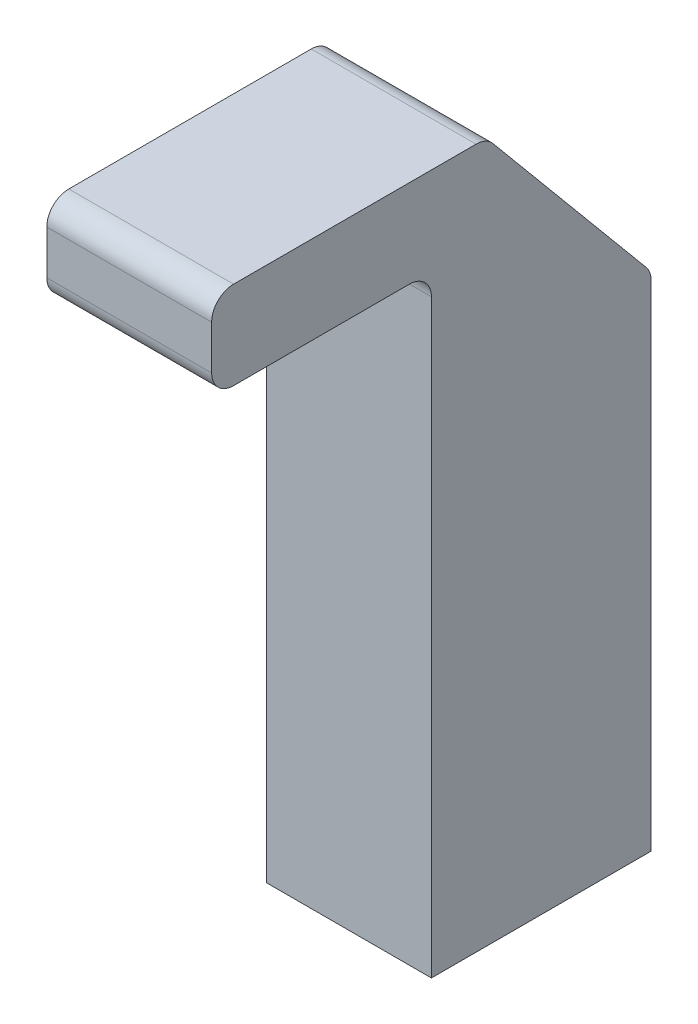
ISO-10303-21;
HEADER;
FILE_DESCRIPTION(('STEP AP214'),'2;1');
FILE_NAME('part.step','',(''),(''),'','','');
FILE_SCHEMA(('AUTOMOTIVE_DESIGN { 1 0 10303 214 1 1 1 1 }'));
ENDSEC;
DATA;
#1=APPLICATION_CONTEXT('core data for automotive mechanical design processes');
#2=APPLICATION_PROTOCOL_DEFINITION('international standard','automotive_design',2000,#1);
#3=PRODUCT_CONTEXT('',#1,'mechanical');
#4=PRODUCT('Part','Part','',(#3));
#5=PRODUCT_RELATED_PRODUCT_CATEGORY('part','',(#4));
#6=PRODUCT_DEFINITION_FORMATION('','',#4);
#7=PRODUCT_DEFINITION_CONTEXT('part definition',#1,'design');
#8=PRODUCT_DEFINITION('design','',#6,#7);
#9=PRODUCT_DEFINITION_SHAPE('','',#8);
#10=(LENGTH_UNIT() NAMED_UNIT(*) SI_UNIT(.MILLI.,.METRE.));
#11=(NAMED_UNIT(*) PLANE_ANGLE_UNIT() SI_UNIT($,.RADIAN.));
#12=(NAMED_UNIT(*) SI_UNIT($,.STERADIAN.) SOLID_ANGLE_UNIT());
#13=UNCERTAINTY_MEASURE_WITH_UNIT(LENGTH_MEASURE(1.E-05),#10,'distance_accuracy_value','');
#14=(GEOMETRIC_REPRESENTATION_CONTEXT(3) GLOBAL_UNCERTAINTY_ASSIGNED_CONTEXT((#13)) GLOBAL_UNIT_ASSIGNED_CONTEXT((#10,
#11,#12)) REPRESENTATION_CONTEXT('',''));
#15=CARTESIAN_POINT('',(0.,0.,0.));
#16=DIRECTION('',(0.,0.,1.));
#17=DIRECTION('',(1.,0.,0.));
#18=AXIS2_PLACEMENT_3D('',#15,#16,#17);
#19=CARTESIAN_POINT('',(7.5,0.,-20.));
#20=DIRECTION('',(0.,1.,0.));
#21=DIRECTION('',(0.,0.,1.));
#22=AXIS2_PLACEMENT_3D('',#19,#20,#21);
#23=PLANE('',#22);
#24=DIRECTION('',(0.,0.,-1.));
#25=VECTOR('',#24,1.);
#26=CARTESIAN_POINT('',(7.5,0.,-20.));
#27=LINE('',#26,#25);
#28=CARTESIAN_POINT('',(7.5,0.,-2.));
#29=VERTEX_POINT('',#28);
#30=CARTESIAN_POINT('',(7.5,0.,-18.));
#31=VERTEX_POINT('',#30);
#32=EDGE_CURVE('E137',#29,#31,#27,.T.);
#33=ORIENTED_EDGE('',*,*,#32,.F.);
#34=DIRECTION('',(-1.,0.,0.));
#35=VECTOR('',#34,1.);
#36=CARTESIAN_POINT('',(7.5,0.,-2.));
#37=LINE('',#36,#35);
#38=CARTESIAN_POINT('',(-7.5,0.,-2.));
#39=VERTEX_POINT('',#38);
#40=EDGE_CURVE('E221',#29,#39,#37,.T.);
#41=ORIENTED_EDGE('',*,*,#40,.T.);
#42=DIRECTION('',(0.,0.,-1.));
#43=VECTOR('',#42,1.);
#44=CARTESIAN_POINT('',(-7.5,0.,-20.));
#45=LINE('',#44,#43);
#46=CARTESIAN_POINT('',(-7.5,0.,-18.));
#47=VERTEX_POINT('',#46);
#48=EDGE_CURVE('E164',#39,#47,#45,.T.);
#49=ORIENTED_EDGE('',*,*,#48,.T.);
#50=DIRECTION('',(-1.,0.,0.));
#51=VECTOR('',#50,1.);
#52=CARTESIAN_POINT('',(7.5,0.,-18.));
#53=LINE('',#52,#51);
#54=EDGE_CURVE('E219',#47,#31,#53,.F.);
#55=ORIENTED_EDGE('',*,*,#54,.T.);
#56=EDGE_LOOP('',(#33,#41,#49,#55));
#57=FACE_BOUND('',#56,.T.);
#58=ADVANCED_FACE('F37',(#57),#23,.F.);
#59=CARTESIAN_POINT('',(7.5,-55.68,-20.));
#60=DIRECTION('',(0.,0.,-1.));
#61=DIRECTION('',(-1.,0.,0.));
#62=AXIS2_PLACEMENT_3D('',#59,#60,#61);
#63=PLANE('',#62);
#64=DIRECTION('',(0.,-1.,0.));
#65=VECTOR('',#64,1.);
#66=CARTESIAN_POINT('',(7.5,-55.68,-20.));
#67=LINE('',#66,#65);
#68=CARTESIAN_POINT('',(7.5,-1.99999999999999,-20.));
#69=VERTEX_POINT('',#68);
#70=CARTESIAN_POINT('',(7.5,-55.68,-20.));
#71=VERTEX_POINT('',#70);
#72=EDGE_CURVE('E125',#69,#71,#67,.T.);
#73=ORIENTED_EDGE('',*,*,#72,.F.);
#74=DIRECTION('',(-1.,0.,0.));
#75=VECTOR('',#74,1.);
#76=CARTESIAN_POINT('',(-7.5,-1.99999999999999,-20.));
#77=LINE('',#76,#75);
#78=CARTESIAN_POINT('',(-7.5,-1.99999999999999,-20.));
#79=VERTEX_POINT('',#78);
#80=EDGE_CURVE('E224',#69,#79,#77,.T.);
#81=ORIENTED_EDGE('',*,*,#80,.T.);
#82=DIRECTION('',(0.,-1.,0.));
#83=VECTOR('',#82,1.);
#84=CARTESIAN_POINT('',(-7.5,-55.68,-20.));
#85=LINE('',#84,#83);
#86=CARTESIAN_POINT('',(-7.5,-55.68,-20.));
#87=VERTEX_POINT('',#86);
#88=EDGE_CURVE('E143',#79,#87,#85,.T.);
#89=ORIENTED_EDGE('',*,*,#88,.T.);
#90=DIRECTION('',(-1.,0.,0.));
#91=VECTOR('',#90,1.);
#92=CARTESIAN_POINT('',(7.5,-55.68,-20.));
#93=LINE('',#92,#91);
#94=EDGE_CURVE('E140',#71,#87,#93,.T.);
#95=ORIENTED_EDGE('',*,*,#94,.F.);
#96=EDGE_LOOP('',(#73,#81,#89,#95));
#97=FACE_BOUND('',#96,.T.);
#98=ADVANCED_FACE('F141',(#97),#63,.F.);
#99=CARTESIAN_POINT('',(7.5,-55.68,-40.));
#100=DIRECTION('',(0.,1.,0.));
#101=DIRECTION('',(0.,0.,1.));
#102=AXIS2_PLACEMENT_3D('',#99,#100,#101);
#103=PLANE('',#102);
#104=CARTESIAN_POINT('',(-4.,-55.68,-31.));
#105=DIRECTION('',(0.,1.,0.));
#106=DIRECTION('',(0.,0.,1.));
#107=AXIS2_PLACEMENT_3D('',#104,#105,#106);
#108=CIRCLE('',#107,1.05);
#109=CARTESIAN_POINT('',(-4.,-55.68,-29.95));
#110=VERTEX_POINT('',#109);
#111=EDGE_CURVE('E272',#110,#110,#108,.F.);
#112=ORIENTED_EDGE('',*,*,#111,.F.);
#113=EDGE_LOOP('',(#112));
#114=FACE_BOUND('',#113,.T.);
#115=CARTESIAN_POINT('',(4.,-55.68,-31.));
#116=DIRECTION('',(0.,1.,0.));
#117=DIRECTION('',(0.,0.,1.));
#118=AXIS2_PLACEMENT_3D('',#115,#116,#117);
#119=CIRCLE('',#118,1.05);
#120=CARTESIAN_POINT('',(4.,-55.68,-29.95));
#121=VERTEX_POINT('',#120);
#122=EDGE_CURVE('E275',#121,#121,#119,.F.);
#123=ORIENTED_EDGE('',*,*,#122,.F.);
#124=EDGE_LOOP('',(#123));
#125=FACE_BOUND('',#124,.T.);
#126=DIRECTION('',(0.,0.,-1.));
#127=VECTOR('',#126,1.);
#128=CARTESIAN_POINT('',(-7.5,-55.68,-40.));
#129=LINE('',#128,#127);
#130=CARTESIAN_POINT('',(-7.5,-55.68,-40.));
#131=VERTEX_POINT('',#130);
#132=EDGE_CURVE('E169',#87,#131,#129,.T.);
#133=ORIENTED_EDGE('',*,*,#132,.T.);
#134=DIRECTION('',(-1.,0.,0.));
#135=VECTOR('',#134,1.);
#136=CARTESIAN_POINT('',(7.5,-55.68,-40.));
#137=LINE('',#136,#135);
#138=CARTESIAN_POINT('',(7.5,-55.68,-40.));
#139=VERTEX_POINT('',#138);
#140=EDGE_CURVE('E147',#139,#131,#137,.T.);
#141=ORIENTED_EDGE('',*,*,#140,.F.);
#142=DIRECTION('',(0.,0.,-1.));
#143=VECTOR('',#142,1.);
#144=CARTESIAN_POINT('',(7.5,-55.68,-40.));
#145=LINE('',#144,#143);
#146=EDGE_CURVE('E130',#71,#139,#145,.T.);
#147=ORIENTED_EDGE('',*,*,#146,.F.);
#148=ORIENTED_EDGE('',*,*,#94,.T.);
#149=EDGE_LOOP('',(#133,#141,#147,#148));
#150=FACE_BOUND('',#149,.T.);
#151=ADVANCED_FACE('F149',(#114,#125,#150),#103,.F.);
#152=CARTESIAN_POINT('',(7.5,-10.,-40.));
#153=DIRECTION('',(0.,0.,1.));
#154=DIRECTION('',(0.,-1.,0.));
#155=AXIS2_PLACEMENT_3D('',#152,#153,#154);
#156=PLANE('',#155);
#157=DIRECTION('',(0.,1.,0.));
#158=VECTOR('',#157,1.);
#159=CARTESIAN_POINT('',(-7.5,-10.,-40.));
#160=LINE('',#159,#158);
#161=CARTESIAN_POINT('',(-7.5,-10.7240998703627,-40.));
#162=VERTEX_POINT('',#161);
#163=EDGE_CURVE('E171',#131,#162,#160,.T.);
#164=ORIENTED_EDGE('',*,*,#163,.T.);
#165=DIRECTION('',(-1.,0.,0.));
#166=VECTOR('',#165,1.);
#167=CARTESIAN_POINT('',(7.5,-10.7240998703627,-40.));
#168=LINE('',#167,#166);
#169=CARTESIAN_POINT('',(7.5,-10.7240998703627,-40.));
#170=VERTEX_POINT('',#169);
#171=EDGE_CURVE('E201',#162,#170,#168,.F.);
#172=ORIENTED_EDGE('',*,*,#171,.T.);
#173=DIRECTION('',(0.,1.,0.));
#174=VECTOR('',#173,1.);
#175=CARTESIAN_POINT('',(7.5,-10.,-40.));
#176=LINE('',#175,#174);
#177=EDGE_CURVE('E152',#139,#170,#176,.T.);
#178=ORIENTED_EDGE('',*,*,#177,.F.);
#179=ORIENTED_EDGE('',*,*,#140,.T.);
#180=EDGE_LOOP('',(#164,#172,#178,#179));
#181=FACE_BOUND('',#180,.T.);
#182=ADVANCED_FACE('F298',(#181),#156,.F.);
#183=CARTESIAN_POINT('',(7.5,8.,-25.));
#184=DIRECTION('',(0.,-0.64018439966448,0.768221279597376));
#185=DIRECTION('',(0.,-0.768221279597376,-0.64018439966448));
#186=AXIS2_PLACEMENT_3D('',#183,#184,#185);
#187=PLANE('',#186);
#188=CARTESIAN_POINT('',(-4.,0.799999999999988,-31.));
#189=DIRECTION('',(0.,-0.64018439966448,0.768221279597376));
#190=DIRECTION('',(0.,0.768221279597376,0.64018439966448));
#191=AXIS2_PLACEMENT_3D('',#188,#189,#190);
#192=ELLIPSE('',#191,3.12409987036267,2.);
#193=CARTESIAN_POINT('',(-4.,3.19999999999999,-29.));
#194=VERTEX_POINT('',#193);
#195=EDGE_CURVE('E167',#194,#194,#192,.T.);
#196=ORIENTED_EDGE('',*,*,#195,.T.);
#197=EDGE_LOOP('',(#196));
#198=FACE_BOUND('',#197,.T.);
#199=CARTESIAN_POINT('',(4.,0.799999999999988,-31.));
#200=DIRECTION('',(0.,-0.64018439966448,0.768221279597376));
#201=DIRECTION('',(0.,0.768221279597376,0.64018439966448));
#202=AXIS2_PLACEMENT_3D('',#199,#200,#201);
#203=ELLIPSE('',#202,3.12409987036267,2.);
#204=CARTESIAN_POINT('',(4.,3.19999999999999,-29.));
#205=VERTEX_POINT('',#204);
#206=EDGE_CURVE('E183',#205,#205,#203,.T.);
#207=ORIENTED_EDGE('',*,*,#206,.T.);
#208=EDGE_LOOP('',(#207));
#209=FACE_BOUND('',#208,.T.);
#210=DIRECTION('',(0.,0.768221279597376,0.64018439966448));
#211=VECTOR('',#210,1.);
#212=CARTESIAN_POINT('',(7.5,8.,-25.));
#213=LINE('',#212,#211);
#214=CARTESIAN_POINT('',(7.5,-9.4437310710337,-39.5364425591947));
#215=VERTEX_POINT('',#214);
#216=CARTESIAN_POINT('',(7.5,7.28036879932896,-25.5996926672259));
#217=VERTEX_POINT('',#216);
#218=EDGE_CURVE('E154',#215,#217,#213,.T.);
#219=ORIENTED_EDGE('',*,*,#218,.F.);
#220=DIRECTION('',(-1.,0.,0.));
#221=VECTOR('',#220,1.);
#222=CARTESIAN_POINT('',(7.5,-9.4437310710337,-39.5364425591947));
#223=LINE('',#222,#221);
#224=CARTESIAN_POINT('',(-7.5,-9.4437310710337,-39.5364425591947));
#225=VERTEX_POINT('',#224);
#226=EDGE_CURVE('E190',#215,#225,#223,.T.);
#227=ORIENTED_EDGE('',*,*,#226,.T.);
#228=DIRECTION('',(0.,0.768221279597376,0.64018439966448));
#229=VECTOR('',#228,1.);
#230=CARTESIAN_POINT('',(-7.5,8.,-25.));
#231=LINE('',#230,#229);
#232=CARTESIAN_POINT('',(-7.5,7.28036879932896,-25.5996926672259));
#233=VERTEX_POINT('',#232);
#234=EDGE_CURVE('E174',#225,#233,#231,.T.);
#235=ORIENTED_EDGE('',*,*,#234,.T.);
#236=DIRECTION('',(-1.,0.,0.));
#237=VECTOR('',#236,1.);
#238=CARTESIAN_POINT('',(7.5,7.28036879932896,-25.5996926672259));
#239=LINE('',#238,#237);
#240=EDGE_CURVE('E146',#233,#217,#239,.F.);
#241=ORIENTED_EDGE('',*,*,#240,.T.);
#242=EDGE_LOOP('',(#219,#227,#235,#241));
#243=FACE_BOUND('',#242,.T.);
#244=ADVANCED_FACE('F331',(#198,#209,#243),#187,.F.);
#245=CARTESIAN_POINT('',(7.5,8.,0.));
#246=DIRECTION('',(0.,-1.,0.));
#247=DIRECTION('',(0.,0.,-1.));
#248=AXIS2_PLACEMENT_3D('',#245,#246,#247);
#249=PLANE('',#248);
#250=DIRECTION('',(0.,0.,1.));
#251=VECTOR('',#250,1.);
#252=CARTESIAN_POINT('',(7.5,8.,0.));
#253=LINE('',#252,#251);
#254=CARTESIAN_POINT('',(7.5,8.,-24.0632501080311));
#255=VERTEX_POINT('',#254);
#256=CARTESIAN_POINT('',(7.5,8.,-2.));
#257=VERTEX_POINT('',#256);
#258=EDGE_CURVE('E160',#255,#257,#253,.T.);
#259=ORIENTED_EDGE('',*,*,#258,.F.);
#260=DIRECTION('',(-1.,0.,0.));
#261=VECTOR('',#260,1.);
#262=CARTESIAN_POINT('',(7.5,8.,-24.0632501080311));
#263=LINE('',#262,#261);
#264=CARTESIAN_POINT('',(-7.5,8.,-24.0632501080311));
#265=VERTEX_POINT('',#264);
#266=EDGE_CURVE('E212',#255,#265,#263,.T.);
#267=ORIENTED_EDGE('',*,*,#266,.T.);
#268=DIRECTION('',(0.,0.,1.));
#269=VECTOR('',#268,1.);
#270=CARTESIAN_POINT('',(-7.5,8.,0.));
#271=LINE('',#270,#269);
#272=CARTESIAN_POINT('',(-7.5,8.,-2.));
#273=VERTEX_POINT('',#272);
#274=EDGE_CURVE('E177',#265,#273,#271,.T.);
#275=ORIENTED_EDGE('',*,*,#274,.T.);
#276=DIRECTION('',(-1.,0.,0.));
#277=VECTOR('',#276,1.);
#278=CARTESIAN_POINT('',(7.5,8.,-2.));
#279=LINE('',#278,#277);
#280=EDGE_CURVE('E210',#273,#257,#279,.F.);
#281=ORIENTED_EDGE('',*,*,#280,.T.);
#282=EDGE_LOOP('',(#259,#267,#275,#281));
#283=FACE_BOUND('',#282,.T.);
#284=ADVANCED_FACE('F328',(#283),#249,.F.);
#285=CARTESIAN_POINT('',(7.5,0.,0.));
#286=DIRECTION('',(0.,0.,-1.));
#287=DIRECTION('',(-1.,0.,0.));
#288=AXIS2_PLACEMENT_3D('',#285,#286,#287);
#289=PLANE('',#288);
#290=DIRECTION('',(0.,-1.,0.));
#291=VECTOR('',#290,1.);
#292=CARTESIAN_POINT('',(7.5,0.,0.));
#293=LINE('',#292,#291);
#294=CARTESIAN_POINT('',(7.5,6.,0.));
#295=VERTEX_POINT('',#294);
#296=CARTESIAN_POINT('',(7.5,2.,0.));
#297=VERTEX_POINT('',#296);
#298=EDGE_CURVE('E162',#295,#297,#293,.T.);
#299=ORIENTED_EDGE('',*,*,#298,.F.);
#300=DIRECTION('',(-1.,0.,0.));
#301=VECTOR('',#300,1.);
#302=CARTESIAN_POINT('',(7.5,6.,0.));
#303=LINE('',#302,#301);
#304=CARTESIAN_POINT('',(-7.5,6.,0.));
#305=VERTEX_POINT('',#304);
#306=EDGE_CURVE('E216',#295,#305,#303,.T.);
#307=ORIENTED_EDGE('',*,*,#306,.T.);
#308=DIRECTION('',(0.,-1.,0.));
#309=VECTOR('',#308,1.);
#310=CARTESIAN_POINT('',(-7.5,0.,0.));
#311=LINE('',#310,#309);
#312=CARTESIAN_POINT('',(-7.5,2.,0.));
#313=VERTEX_POINT('',#312);
#314=EDGE_CURVE('E180',#305,#313,#311,.T.);
#315=ORIENTED_EDGE('',*,*,#314,.T.);
#316=DIRECTION('',(-1.,0.,0.));
#317=VECTOR('',#316,1.);
#318=CARTESIAN_POINT('',(7.5,2.,0.));
#319=LINE('',#318,#317);
#320=EDGE_CURVE('E52',#313,#297,#319,.F.);
#321=ORIENTED_EDGE('',*,*,#320,.T.);
#322=EDGE_LOOP('',(#299,#307,#315,#321));
#323=FACE_BOUND('',#322,.T.);
#324=ADVANCED_FACE('F265',(#323),#289,.F.);
#325=CARTESIAN_POINT('',(7.5,0.,0.));
#326=DIRECTION('',(-1.,0.,0.));
#327=DIRECTION('',(0.,0.,1.));
#328=AXIS2_PLACEMENT_3D('',#325,#326,#327);
#329=PLANE('',#328);
#330=ORIENTED_EDGE('',*,*,#177,.T.);
#331=CARTESIAN_POINT('',(7.5,-10.7240998703627,-38.));
#332=DIRECTION('',(-1.,0.,0.));
#333=DIRECTION('',(0.,0.,1.));
#334=AXIS2_PLACEMENT_3D('',#331,#332,#333);
#335=CIRCLE('',#334,2.);
#336=EDGE_CURVE('E208',#170,#215,#335,.F.);
#337=ORIENTED_EDGE('',*,*,#336,.T.);
#338=ORIENTED_EDGE('',*,*,#218,.T.);
#339=CARTESIAN_POINT('',(7.5,6.,-24.0632501080311));
#340=DIRECTION('',(-1.,0.,0.));
#341=DIRECTION('',(0.,0.,1.));
#342=AXIS2_PLACEMENT_3D('',#339,#340,#341);
#343=CIRCLE('',#342,2.);
#344=EDGE_CURVE('E206',#217,#255,#343,.F.);
#345=ORIENTED_EDGE('',*,*,#344,.T.);
#346=ORIENTED_EDGE('',*,*,#258,.T.);
#347=CARTESIAN_POINT('',(7.5,6.,-2.));
#348=DIRECTION('',(-1.,0.,0.));
#349=DIRECTION('',(0.,0.,1.));
#350=AXIS2_PLACEMENT_3D('',#347,#348,#349);
#351=CIRCLE('',#350,2.);
#352=EDGE_CURVE('E59',#257,#295,#351,.F.);
#353=ORIENTED_EDGE('',*,*,#352,.T.);
#354=ORIENTED_EDGE('',*,*,#298,.T.);
#355=CARTESIAN_POINT('',(7.5,2.,-2.));
#356=DIRECTION('',(-1.,0.,0.));
#357=DIRECTION('',(0.,0.,1.));
#358=AXIS2_PLACEMENT_3D('',#355,#356,#357);
#359=CIRCLE('',#358,2.);
#360=EDGE_CURVE('E203',#297,#29,#359,.F.);
#361=ORIENTED_EDGE('',*,*,#360,.T.);
#362=ORIENTED_EDGE('',*,*,#32,.T.);
#363=CARTESIAN_POINT('',(7.5,-1.99999999999999,-18.));
#364=DIRECTION('',(-1.,0.,0.));
#365=DIRECTION('',(0.,0.,1.));
#366=AXIS2_PLACEMENT_3D('',#363,#364,#365);
#367=CIRCLE('',#366,2.);
#368=EDGE_CURVE('E12',#31,#69,#367,.T.);
#369=ORIENTED_EDGE('',*,*,#368,.T.);
#370=ORIENTED_EDGE('',*,*,#72,.T.);
#371=ORIENTED_EDGE('',*,*,#146,.T.);
#372=EDGE_LOOP('',(#330,#337,#338,#345,#346,#353,#354,#361,#362,#369,#370,#371));
#373=FACE_BOUND('',#372,.T.);
#374=ADVANCED_FACE('F128',(#373),#329,.F.);
#375=CARTESIAN_POINT('',(-7.5,0.,0.));
#376=DIRECTION('',(-1.,0.,0.));
#377=DIRECTION('',(0.,0.,1.));
#378=AXIS2_PLACEMENT_3D('',#375,#376,#377);
#379=PLANE('',#378);
#380=ORIENTED_EDGE('',*,*,#234,.F.);
#381=CARTESIAN_POINT('',(-7.5,-10.7240998703627,-38.));
#382=DIRECTION('',(-1.,0.,0.));
#383=DIRECTION('',(0.,0.,1.));
#384=AXIS2_PLACEMENT_3D('',#381,#382,#383);
#385=CIRCLE('',#384,2.);
#386=EDGE_CURVE('E199',#225,#162,#385,.T.);
#387=ORIENTED_EDGE('',*,*,#386,.T.);
#388=ORIENTED_EDGE('',*,*,#163,.F.);
#389=ORIENTED_EDGE('',*,*,#132,.F.);
#390=ORIENTED_EDGE('',*,*,#88,.F.);
#391=CARTESIAN_POINT('',(-7.5,-1.99999999999999,-18.));
#392=DIRECTION('',(-1.,0.,0.));
#393=DIRECTION('',(0.,0.,1.));
#394=AXIS2_PLACEMENT_3D('',#391,#392,#393);
#395=CIRCLE('',#394,2.);
#396=EDGE_CURVE('E45',#79,#47,#395,.F.);
#397=ORIENTED_EDGE('',*,*,#396,.T.);
#398=ORIENTED_EDGE('',*,*,#48,.F.);
#399=CARTESIAN_POINT('',(-7.5,2.,-2.));
#400=DIRECTION('',(-1.,0.,0.));
#401=DIRECTION('',(0.,0.,1.));
#402=AXIS2_PLACEMENT_3D('',#399,#400,#401);
#403=CIRCLE('',#402,2.);
#404=EDGE_CURVE('E193',#39,#313,#403,.T.);
#405=ORIENTED_EDGE('',*,*,#404,.T.);
#406=ORIENTED_EDGE('',*,*,#314,.F.);
#407=CARTESIAN_POINT('',(-7.5,6.,-2.));
#408=DIRECTION('',(-1.,0.,0.));
#409=DIRECTION('',(0.,0.,1.));
#410=AXIS2_PLACEMENT_3D('',#407,#408,#409);
#411=CIRCLE('',#410,2.);
#412=EDGE_CURVE('E195',#305,#273,#411,.T.);
#413=ORIENTED_EDGE('',*,*,#412,.T.);
#414=ORIENTED_EDGE('',*,*,#274,.F.);
#415=CARTESIAN_POINT('',(-7.5,6.,-24.0632501080311));
#416=DIRECTION('',(-1.,0.,0.));
#417=DIRECTION('',(0.,0.,1.));
#418=AXIS2_PLACEMENT_3D('',#415,#416,#417);
#419=CIRCLE('',#418,2.);
#420=EDGE_CURVE('E197',#265,#233,#419,.T.);
#421=ORIENTED_EDGE('',*,*,#420,.T.);
#422=EDGE_LOOP('',(#380,#387,#388,#389,#390,#397,#398,#405,#406,#413,#414,#421));
#423=FACE_BOUND('',#422,.T.);
#424=ADVANCED_FACE('F228',(#423),#379,.T.);
#425=CARTESIAN_POINT('',(4.,-61.3368542494924,-31.));
#426=DIRECTION('',(0.,1.,0.));
#427=DIRECTION('',(0.,0.,1.));
#428=AXIS2_PLACEMENT_3D('',#425,#426,#427);
#429=CYLINDRICAL_SURFACE('',#428,2.);
#430=CARTESIAN_POINT('',(4.,-50.68,-31.));
#431=DIRECTION('',(0.,1.,0.));
#432=DIRECTION('',(0.,0.,1.));
#433=AXIS2_PLACEMENT_3D('',#430,#431,#432);
#434=CIRCLE('',#433,2.);
#435=CARTESIAN_POINT('',(4.,-50.68,-29.));
#436=VERTEX_POINT('',#435);
#437=EDGE_CURVE('E269',#436,#436,#434,.F.);
#438=ORIENTED_EDGE('',*,*,#437,.T.);
#439=EDGE_LOOP('',(#438));
#440=FACE_BOUND('',#439,.T.);
#441=ORIENTED_EDGE('',*,*,#206,.F.);
#442=EDGE_LOOP('',(#441));
#443=FACE_BOUND('',#442,.T.);
#444=ADVANCED_FACE('F317',(#440,#443),#429,.F.);
#445=CARTESIAN_POINT('',(7.5,-50.68,-40.));
#446=DIRECTION('',(0.,1.,0.));
#447=DIRECTION('',(0.,0.,1.));
#448=AXIS2_PLACEMENT_3D('',#445,#446,#447);
#449=PLANE('',#448);
#450=CARTESIAN_POINT('',(4.,-50.68,-31.));
#451=DIRECTION('',(0.,1.,0.));
#452=DIRECTION('',(0.,0.,1.));
#453=AXIS2_PLACEMENT_3D('',#450,#451,#452);
#454=CIRCLE('',#453,1.05);
#455=CARTESIAN_POINT('',(4.,-50.68,-29.95));
#456=VERTEX_POINT('',#455);
#457=EDGE_CURVE('E279',#456,#456,#454,.F.);
#458=ORIENTED_EDGE('',*,*,#457,.T.);
#459=EDGE_LOOP('',(#458));
#460=FACE_BOUND('',#459,.T.);
#461=ORIENTED_EDGE('',*,*,#437,.F.);
#462=EDGE_LOOP('',(#461));
#463=FACE_BOUND('',#462,.T.);
#464=ADVANCED_FACE('F313',(#460,#463),#449,.T.);
#465=CARTESIAN_POINT('',(-4.,-61.3368542494924,-31.));
#466=DIRECTION('',(0.,1.,0.));
#467=DIRECTION('',(0.,0.,1.));
#468=AXIS2_PLACEMENT_3D('',#465,#466,#467);
#469=CYLINDRICAL_SURFACE('',#468,2.);
#470=CARTESIAN_POINT('',(-4.,-50.68,-31.));
#471=DIRECTION('',(0.,1.,0.));
#472=DIRECTION('',(0.,0.,1.));
#473=AXIS2_PLACEMENT_3D('',#470,#471,#472);
#474=CIRCLE('',#473,2.);
#475=CARTESIAN_POINT('',(-4.,-50.68,-29.));
#476=VERTEX_POINT('',#475);
#477=EDGE_CURVE('E186',#476,#476,#474,.F.);
#478=ORIENTED_EDGE('',*,*,#477,.T.);
#479=EDGE_LOOP('',(#478));
#480=FACE_BOUND('',#479,.T.);
#481=ORIENTED_EDGE('',*,*,#195,.F.);
#482=EDGE_LOOP('',(#481));
#483=FACE_BOUND('',#482,.T.);
#484=ADVANCED_FACE('F307',(#480,#483),#469,.F.);
#485=CARTESIAN_POINT('',(7.5,-50.68,-40.));
#486=DIRECTION('',(0.,1.,0.));
#487=DIRECTION('',(0.,0.,1.));
#488=AXIS2_PLACEMENT_3D('',#485,#486,#487);
#489=PLANE('',#488);
#490=CARTESIAN_POINT('',(-4.,-50.68,-31.));
#491=DIRECTION('',(0.,1.,0.));
#492=DIRECTION('',(0.,0.,1.));
#493=AXIS2_PLACEMENT_3D('',#490,#491,#492);
#494=CIRCLE('',#493,1.05);
#495=CARTESIAN_POINT('',(-4.,-50.68,-29.95));
#496=VERTEX_POINT('',#495);
#497=EDGE_CURVE('E278',#496,#496,#494,.F.);
#498=ORIENTED_EDGE('',*,*,#497,.T.);
#499=EDGE_LOOP('',(#498));
#500=FACE_BOUND('',#499,.T.);
#501=ORIENTED_EDGE('',*,*,#477,.F.);
#502=EDGE_LOOP('',(#501));
#503=FACE_BOUND('',#502,.T.);
#504=ADVANCED_FACE('F287',(#500,#503),#489,.T.);
#505=CARTESIAN_POINT('',(4.,-55.681,-31.));
#506=DIRECTION('',(0.,1.,0.));
#507=DIRECTION('',(0.,0.,1.));
#508=AXIS2_PLACEMENT_3D('',#505,#506,#507);
#509=CYLINDRICAL_SURFACE('',#508,1.05);
#510=CARTESIAN_POINT('',(4.,-50.68,-29.95));
#511=CARTESIAN_POINT('',(4.,-50.7320833333333,-29.95));
#512=CARTESIAN_POINT('',(4.,-50.7841666666667,-29.95));
#513=CARTESIAN_POINT('',(4.,-50.8883333333333,-29.95));
#514=CARTESIAN_POINT('',(4.,-50.9404166666667,-29.95));
#515=CARTESIAN_POINT('',(4.,-51.0445833333333,-29.95));
#516=CARTESIAN_POINT('',(4.,-51.0966666666667,-29.95));
#517=CARTESIAN_POINT('',(4.,-51.2008333333333,-29.95));
#518=CARTESIAN_POINT('',(4.,-51.2529166666667,-29.95));
#519=CARTESIAN_POINT('',(4.,-51.3570833333333,-29.95));
#520=CARTESIAN_POINT('',(4.,-51.4091666666667,-29.95));
#521=CARTESIAN_POINT('',(4.,-51.5133333333333,-29.95));
#522=CARTESIAN_POINT('',(4.,-51.5654166666667,-29.95));
#523=CARTESIAN_POINT('',(4.,-51.6695833333333,-29.95));
#524=CARTESIAN_POINT('',(4.,-51.7216666666667,-29.95));
#525=CARTESIAN_POINT('',(4.,-51.8258333333333,-29.95));
#526=CARTESIAN_POINT('',(4.,-51.8779166666667,-29.95));
#527=CARTESIAN_POINT('',(4.,-51.9820833333333,-29.95));
#528=CARTESIAN_POINT('',(4.,-52.0341666666667,-29.95));
#529=CARTESIAN_POINT('',(4.,-52.1383333333333,-29.95));
#530=CARTESIAN_POINT('',(4.,-52.1904166666667,-29.95));
#531=CARTESIAN_POINT('',(4.,-52.2945833333333,-29.95));
#532=CARTESIAN_POINT('',(4.,-52.3466666666667,-29.95));
#533=CARTESIAN_POINT('',(4.,-52.4508333333333,-29.95));
#534=CARTESIAN_POINT('',(4.,-52.5029166666667,-29.95));
#535=CARTESIAN_POINT('',(4.,-52.6070833333333,-29.95));
#536=CARTESIAN_POINT('',(4.,-52.6591666666667,-29.95));
#537=CARTESIAN_POINT('',(4.,-52.7633333333333,-29.95));
#538=CARTESIAN_POINT('',(4.,-52.8154166666667,-29.95));
#539=CARTESIAN_POINT('',(4.,-52.9195833333333,-29.95));
#540=CARTESIAN_POINT('',(4.,-52.9716666666667,-29.95));
#541=CARTESIAN_POINT('',(4.,-53.0758333333333,-29.95));
#542=CARTESIAN_POINT('',(4.,-53.1279166666667,-29.95));
#543=CARTESIAN_POINT('',(4.,-53.2320833333333,-29.95));
#544=CARTESIAN_POINT('',(4.,-53.2841666666667,-29.95));
#545=CARTESIAN_POINT('',(4.,-53.3883333333333,-29.95));
#546=CARTESIAN_POINT('',(4.,-53.4404166666667,-29.95));
#547=CARTESIAN_POINT('',(4.,-53.5445833333333,-29.95));
#548=CARTESIAN_POINT('',(4.,-53.5966666666667,-29.95));
#549=CARTESIAN_POINT('',(4.,-53.7008333333333,-29.95));
#550=CARTESIAN_POINT('',(4.,-53.7529166666667,-29.95));
#551=CARTESIAN_POINT('',(4.,-53.8570833333333,-29.95));
#552=CARTESIAN_POINT('',(4.,-53.9091666666667,-29.95));
#553=CARTESIAN_POINT('',(4.,-54.0133333333333,-29.95));
#554=CARTESIAN_POINT('',(4.,-54.0654166666667,-29.95));
#555=CARTESIAN_POINT('',(4.,-54.1695833333333,-29.95));
#556=CARTESIAN_POINT('',(4.,-54.2216666666667,-29.95));
#557=CARTESIAN_POINT('',(4.,-54.3258333333333,-29.95));
#558=CARTESIAN_POINT('',(4.,-54.3779166666667,-29.95));
#559=CARTESIAN_POINT('',(4.,-54.4820833333333,-29.95));
#560=CARTESIAN_POINT('',(4.,-54.5341666666667,-29.95));
#561=CARTESIAN_POINT('',(4.,-54.6383333333333,-29.95));
#562=CARTESIAN_POINT('',(4.,-54.6904166666667,-29.95));
#563=CARTESIAN_POINT('',(4.,-54.7945833333333,-29.95));
#564=CARTESIAN_POINT('',(4.,-54.8466666666667,-29.95));
#565=CARTESIAN_POINT('',(4.,-54.9508333333333,-29.95));
#566=CARTESIAN_POINT('',(4.,-55.0029166666667,-29.95));
#567=CARTESIAN_POINT('',(4.,-55.1070833333333,-29.95));
#568=CARTESIAN_POINT('',(4.,-55.1591666666667,-29.95));
#569=CARTESIAN_POINT('',(4.,-55.2633333333333,-29.95));
#570=CARTESIAN_POINT('',(4.,-55.3154166666667,-29.95));
#571=CARTESIAN_POINT('',(4.,-55.4195833333333,-29.95));
#572=CARTESIAN_POINT('',(4.,-55.4716666666667,-29.95));
#573=CARTESIAN_POINT('',(4.,-55.5758333333333,-29.95));
#574=CARTESIAN_POINT('',(4.,-55.6279166666667,-29.95));
#575=CARTESIAN_POINT('',(4.,-55.68,-29.95));
#576=B_SPLINE_CURVE_WITH_KNOTS('',3,(#510,#511,#512,#513,#514,#515,#516,#517,#518,#519,#520,
#521,#522,#523,#524,#525,#526,#527,#528,#529,#530,#531,#532,#533,#534,#535,#536,#537,#538,#539,
#540,#541,#542,#543,#544,#545,#546,#547,#548,#549,#550,#551,#552,#553,#554,#555,#556,#557,#558,
#559,#560,#561,#562,#563,#564,#565,#566,#567,#568,#569,#570,#571,#572,#573,#574,#575),
.UNSPECIFIED.,.F.,.F.,(4,2,2,2,2,2,2,2,2,2,2,2,2,2,2,2,2,2,2,2,2,2,2,2,2,2,2,2,2,2,2,2,4),(0.,
0.156250000000004,0.312500000000007,0.468750000000004,0.625000000000001,0.781250000000004,
0.937500000000001,1.09375,1.25,1.40625,1.5625,1.71875,1.875,2.03125000000001,2.1875,
2.34375000000001,2.5,2.65625,2.8125,2.96875,3.125,3.28125,3.4375,3.59375,3.75,3.90625,4.0625,
4.21875,4.375,4.53125,4.6875,4.84375,5.),.UNSPECIFIED.);
#577=EDGE_CURVE('BSEAM292',#456,#121,#576,.T.);
#578=ORIENTED_EDGE('',*,*,#457,.F.);
#579=ORIENTED_EDGE('',*,*,#122,.T.);
#580=ORIENTED_EDGE('',*,*,#577,.T.);
#581=ORIENTED_EDGE('',*,*,#577,.F.);
#582=EDGE_LOOP('',(#578,#580,#579,#581));
#583=FACE_BOUND('',#582,.T.);
#584=ADVANCED_FACE('F292',(#583),#509,.F.);
#585=CARTESIAN_POINT('',(-4.,-55.681,-31.));
#586=DIRECTION('',(0.,1.,0.));
#587=DIRECTION('',(0.,0.,1.));
#588=AXIS2_PLACEMENT_3D('',#585,#586,#587);
#589=CYLINDRICAL_SURFACE('',#588,1.05);
#590=CARTESIAN_POINT('',(-4.,-50.68,-29.95));
#591=CARTESIAN_POINT('',(-4.,-50.7320833333333,-29.95));
#592=CARTESIAN_POINT('',(-4.,-50.7841666666667,-29.95));
#593=CARTESIAN_POINT('',(-4.,-50.8883333333333,-29.95));
#594=CARTESIAN_POINT('',(-4.,-50.9404166666667,-29.95));
#595=CARTESIAN_POINT('',(-4.,-51.0445833333333,-29.95));
#596=CARTESIAN_POINT('',(-4.,-51.0966666666667,-29.95));
#597=CARTESIAN_POINT('',(-4.,-51.2008333333333,-29.95));
#598=CARTESIAN_POINT('',(-4.,-51.2529166666667,-29.95));
#599=CARTESIAN_POINT('',(-4.,-51.3570833333333,-29.95));
#600=CARTESIAN_POINT('',(-4.,-51.4091666666667,-29.95));
#601=CARTESIAN_POINT('',(-4.,-51.5133333333333,-29.95));
#602=CARTESIAN_POINT('',(-4.,-51.5654166666667,-29.95));
#603=CARTESIAN_POINT('',(-4.,-51.6695833333333,-29.95));
#604=CARTESIAN_POINT('',(-4.,-51.7216666666667,-29.95));
#605=CARTESIAN_POINT('',(-4.,-51.8258333333333,-29.95));
#606=CARTESIAN_POINT('',(-4.,-51.8779166666667,-29.95));
#607=CARTESIAN_POINT('',(-4.,-51.9820833333333,-29.95));
#608=CARTESIAN_POINT('',(-4.,-52.0341666666667,-29.95));
#609=CARTESIAN_POINT('',(-4.,-52.1383333333333,-29.95));
#610=CARTESIAN_POINT('',(-4.,-52.1904166666667,-29.95));
#611=CARTESIAN_POINT('',(-4.,-52.2945833333333,-29.95));
#612=CARTESIAN_POINT('',(-4.,-52.3466666666667,-29.95));
#613=CARTESIAN_POINT('',(-4.,-52.4508333333333,-29.95));
#614=CARTESIAN_POINT('',(-4.,-52.5029166666667,-29.95));
#615=CARTESIAN_POINT('',(-4.,-52.6070833333333,-29.95));
#616=CARTESIAN_POINT('',(-4.,-52.6591666666667,-29.95));
#617=CARTESIAN_POINT('',(-4.,-52.7633333333333,-29.95));
#618=CARTESIAN_POINT('',(-4.,-52.8154166666667,-29.95));
#619=CARTESIAN_POINT('',(-4.,-52.9195833333333,-29.95));
#620=CARTESIAN_POINT('',(-4.,-52.9716666666667,-29.95));
#621=CARTESIAN_POINT('',(-4.,-53.0758333333333,-29.95));
#622=CARTESIAN_POINT('',(-4.,-53.1279166666667,-29.95));
#623=CARTESIAN_POINT('',(-4.,-53.2320833333333,-29.95));
#624=CARTESIAN_POINT('',(-4.,-53.2841666666667,-29.95));
#625=CARTESIAN_POINT('',(-4.,-53.3883333333333,-29.95));
#626=CARTESIAN_POINT('',(-4.,-53.4404166666667,-29.95));
#627=CARTESIAN_POINT('',(-4.,-53.5445833333333,-29.95));
#628=CARTESIAN_POINT('',(-4.,-53.5966666666667,-29.95));
#629=CARTESIAN_POINT('',(-4.,-53.7008333333333,-29.95));
#630=CARTESIAN_POINT('',(-4.,-53.7529166666667,-29.95));
#631=CARTESIAN_POINT('',(-4.,-53.8570833333333,-29.95));
#632=CARTESIAN_POINT('',(-4.,-53.9091666666667,-29.95));
#633=CARTESIAN_POINT('',(-4.,-54.0133333333333,-29.95));
#634=CARTESIAN_POINT('',(-4.,-54.0654166666667,-29.95));
#635=CARTESIAN_POINT('',(-4.,-54.1695833333333,-29.95));
#636=CARTESIAN_POINT('',(-4.,-54.2216666666667,-29.95));
#637=CARTESIAN_POINT('',(-4.,-54.3258333333333,-29.95));
#638=CARTESIAN_POINT('',(-4.,-54.3779166666667,-29.95));
#639=CARTESIAN_POINT('',(-4.,-54.4820833333333,-29.95));
#640=CARTESIAN_POINT('',(-4.,-54.5341666666667,-29.95));
#641=CARTESIAN_POINT('',(-4.,-54.6383333333333,-29.95));
#642=CARTESIAN_POINT('',(-4.,-54.6904166666667,-29.95));
#643=CARTESIAN_POINT('',(-4.,-54.7945833333333,-29.95));
#644=CARTESIAN_POINT('',(-4.,-54.8466666666667,-29.95));
#645=CARTESIAN_POINT('',(-4.,-54.9508333333333,-29.95));
#646=CARTESIAN_POINT('',(-4.,-55.0029166666667,-29.95));
#647=CARTESIAN_POINT('',(-4.,-55.1070833333333,-29.95));
#648=CARTESIAN_POINT('',(-4.,-55.1591666666667,-29.95));
#649=CARTESIAN_POINT('',(-4.,-55.2633333333333,-29.95));
#650=CARTESIAN_POINT('',(-4.,-55.3154166666667,-29.95));
#651=CARTESIAN_POINT('',(-4.,-55.4195833333333,-29.95));
#652=CARTESIAN_POINT('',(-4.,-55.4716666666667,-29.95));
#653=CARTESIAN_POINT('',(-4.,-55.5758333333333,-29.95));
#654=CARTESIAN_POINT('',(-4.,-55.6279166666667,-29.95));
#655=CARTESIAN_POINT('',(-4.,-55.68,-29.95));
#656=B_SPLINE_CURVE_WITH_KNOTS('',3,(#590,#591,#592,#593,#594,#595,#596,#597,#598,#599,#600,
#601,#602,#603,#604,#605,#606,#607,#608,#609,#610,#611,#612,#613,#614,#615,#616,#617,#618,#619,
#620,#621,#622,#623,#624,#625,#626,#627,#628,#629,#630,#631,#632,#633,#634,#635,#636,#637,#638,
#639,#640,#641,#642,#643,#644,#645,#646,#647,#648,#649,#650,#651,#652,#653,#654,#655),
.UNSPECIFIED.,.F.,.F.,(4,2,2,2,2,2,2,2,2,2,2,2,2,2,2,2,2,2,2,2,2,2,2,2,2,2,2,2,2,2,2,2,4),(0.,
0.156250000000004,0.312500000000007,0.468750000000004,0.625000000000001,0.781250000000004,
0.937500000000001,1.09375,1.25,1.40625,1.5625,1.71875,1.875,2.03125000000001,2.1875,
2.34375000000001,2.5,2.65625,2.8125,2.96875,3.125,3.28125,3.4375,3.59375,3.75,3.90625,4.0625,
4.21875,4.375,4.53125,4.6875,4.84375,5.),.UNSPECIFIED.);
#657=EDGE_CURVE('BSEAM253',#496,#110,#656,.T.);
#658=ORIENTED_EDGE('',*,*,#497,.F.);
#659=ORIENTED_EDGE('',*,*,#111,.T.);
#660=ORIENTED_EDGE('',*,*,#657,.T.);
#661=ORIENTED_EDGE('',*,*,#657,.F.);
#662=EDGE_LOOP('',(#658,#660,#659,#661));
#663=FACE_BOUND('',#662,.T.);
#664=ADVANCED_FACE('F253',(#663),#589,.F.);
#665=CARTESIAN_POINT('',(7.5,-10.7240998703627,-38.));
#666=DIRECTION('',(-1.,0.,0.));
#667=DIRECTION('',(0.,0.,1.));
#668=AXIS2_PLACEMENT_3D('',#665,#666,#667);
#669=CYLINDRICAL_SURFACE('',#668,2.);
#670=ORIENTED_EDGE('',*,*,#336,.F.);
#671=ORIENTED_EDGE('',*,*,#171,.F.);
#672=ORIENTED_EDGE('',*,*,#386,.F.);
#673=ORIENTED_EDGE('',*,*,#226,.F.);
#674=EDGE_LOOP('',(#670,#671,#672,#673));
#675=FACE_BOUND('',#674,.T.);
#676=ADVANCED_FACE('F249',(#675),#669,.T.);
#677=CARTESIAN_POINT('',(7.5,6.,-24.0632501080311));
#678=DIRECTION('',(-1.,0.,0.));
#679=DIRECTION('',(0.,0.,1.));
#680=AXIS2_PLACEMENT_3D('',#677,#678,#679);
#681=CYLINDRICAL_SURFACE('',#680,2.);
#682=ORIENTED_EDGE('',*,*,#344,.F.);
#683=ORIENTED_EDGE('',*,*,#240,.F.);
#684=ORIENTED_EDGE('',*,*,#420,.F.);
#685=ORIENTED_EDGE('',*,*,#266,.F.);
#686=EDGE_LOOP('',(#682,#683,#684,#685));
#687=FACE_BOUND('',#686,.T.);
#688=ADVANCED_FACE('F252',(#687),#681,.T.);
#689=CARTESIAN_POINT('',(7.5,6.,-2.));
#690=DIRECTION('',(-1.,0.,0.));
#691=DIRECTION('',(0.,0.,1.));
#692=AXIS2_PLACEMENT_3D('',#689,#690,#691);
#693=CYLINDRICAL_SURFACE('',#692,2.);
#694=ORIENTED_EDGE('',*,*,#352,.F.);
#695=ORIENTED_EDGE('',*,*,#280,.F.);
#696=ORIENTED_EDGE('',*,*,#412,.F.);
#697=ORIENTED_EDGE('',*,*,#306,.F.);
#698=EDGE_LOOP('',(#694,#695,#696,#697));
#699=FACE_BOUND('',#698,.T.);
#700=ADVANCED_FACE('F239',(#699),#693,.T.);
#701=CARTESIAN_POINT('',(7.5,2.,-2.));
#702=DIRECTION('',(-1.,0.,0.));
#703=DIRECTION('',(0.,0.,1.));
#704=AXIS2_PLACEMENT_3D('',#701,#702,#703);
#705=CYLINDRICAL_SURFACE('',#704,2.);
#706=ORIENTED_EDGE('',*,*,#360,.F.);
#707=ORIENTED_EDGE('',*,*,#320,.F.);
#708=ORIENTED_EDGE('',*,*,#404,.F.);
#709=ORIENTED_EDGE('',*,*,#40,.F.);
#710=EDGE_LOOP('',(#706,#707,#708,#709));
#711=FACE_BOUND('',#710,.T.);
#712=ADVANCED_FACE('F235',(#711),#705,.T.);
#713=CARTESIAN_POINT('',(7.5,-1.99999999999999,-18.));
#714=DIRECTION('',(1.,0.,0.));
#715=DIRECTION('',(0.,0.,-1.));
#716=AXIS2_PLACEMENT_3D('',#713,#714,#715);
#717=CYLINDRICAL_SURFACE('',#716,2.);
#718=ORIENTED_EDGE('',*,*,#368,.F.);
#719=ORIENTED_EDGE('',*,*,#54,.F.);
#720=ORIENTED_EDGE('',*,*,#396,.F.);
#721=ORIENTED_EDGE('',*,*,#80,.F.);
#722=EDGE_LOOP('',(#718,#719,#720,#721));
#723=FACE_BOUND('',#722,.T.);
#724=ADVANCED_FACE('F39',(#723),#717,.F.);
#725=CLOSED_SHELL('',(#58,#98,#151,#182,#244,#284,#324,#374,#424,#444,#464,#484,#504,#584,#664,
#676,#688,#700,#712,#724));
#726=MANIFOLD_SOLID_BREP('B2',#725);
#727=ADVANCED_BREP_SHAPE_REPRESENTATION('',(#18,#726),#14);
#728=SHAPE_DEFINITION_REPRESENTATION(#9,#727);
ENDSEC;
END-ISO-10303-21;
